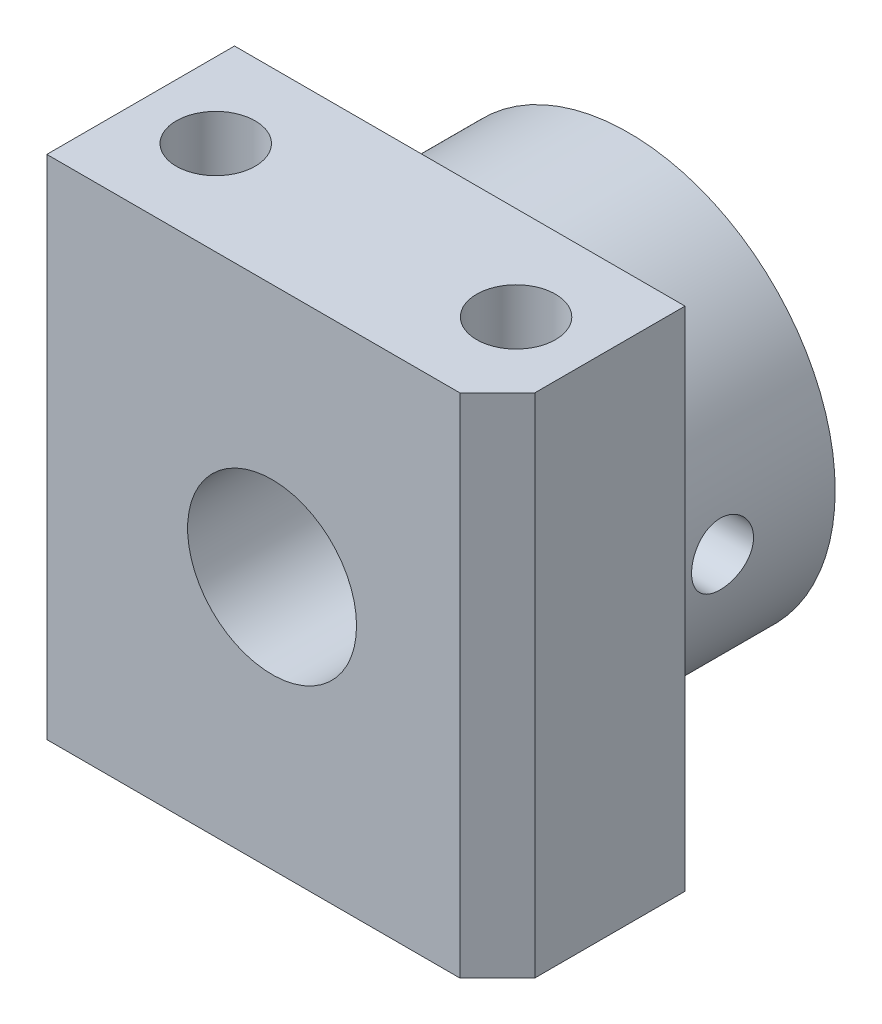
ISO-10303-21;
HEADER;
FILE_DESCRIPTION(('STEP AP214'),'2;1');
FILE_NAME('part.step','',(''),(''),'','','');
FILE_SCHEMA(('AUTOMOTIVE_DESIGN { 1 0 10303 214 1 1 1 1 }'));
ENDSEC;
DATA;
#1=APPLICATION_CONTEXT('core data for automotive mechanical design processes');
#2=APPLICATION_PROTOCOL_DEFINITION('international standard','automotive_design',2000,#1);
#3=PRODUCT_CONTEXT('',#1,'mechanical');
#4=PRODUCT('Part','Part','',(#3));
#5=PRODUCT_RELATED_PRODUCT_CATEGORY('part','',(#4));
#6=PRODUCT_DEFINITION_FORMATION('','',#4);
#7=PRODUCT_DEFINITION_CONTEXT('part definition',#1,'design');
#8=PRODUCT_DEFINITION('design','',#6,#7);
#9=PRODUCT_DEFINITION_SHAPE('','',#8);
#10=(LENGTH_UNIT() NAMED_UNIT(*) SI_UNIT(.MILLI.,.METRE.));
#11=(NAMED_UNIT(*) PLANE_ANGLE_UNIT() SI_UNIT($,.RADIAN.));
#12=(NAMED_UNIT(*) SI_UNIT($,.STERADIAN.) SOLID_ANGLE_UNIT());
#13=UNCERTAINTY_MEASURE_WITH_UNIT(LENGTH_MEASURE(1.E-05),#10,'distance_accuracy_value','');
#14=(GEOMETRIC_REPRESENTATION_CONTEXT(3) GLOBAL_UNCERTAINTY_ASSIGNED_CONTEXT((#13)) GLOBAL_UNIT_ASSIGNED_CONTEXT((#10,
#11,#12)) REPRESENTATION_CONTEXT('',''));
#15=CARTESIAN_POINT('',(0.,0.,0.));
#16=DIRECTION('',(0.,0.,1.));
#17=DIRECTION('',(1.,0.,0.));
#18=AXIS2_PLACEMENT_3D('',#15,#16,#17);
#19=CARTESIAN_POINT('',(12.,13.5,10.));
#20=DIRECTION('',(-1.,0.,0.));
#21=DIRECTION('',(0.,-1.,0.));
#22=AXIS2_PLACEMENT_3D('',#19,#20,#21);
#23=PLANE('',#22);
#24=DIRECTION('',(0.,0.,-1.));
#25=VECTOR('',#24,1.);
#26=CARTESIAN_POINT('',(12.,13.5,10.));
#27=LINE('',#26,#25);
#28=CARTESIAN_POINT('',(12.,13.5,7.99999999999999));
#29=VERTEX_POINT('',#28);
#30=CARTESIAN_POINT('',(12.,13.5,0.));
#31=VERTEX_POINT('',#30);
#32=EDGE_CURVE('E108',#29,#31,#27,.T.);
#33=ORIENTED_EDGE('',*,*,#32,.F.);
#34=DIRECTION('',(0.,-1.,0.));
#35=VECTOR('',#34,1.);
#36=CARTESIAN_POINT('',(12.,-13.5,7.99999999999999));
#37=LINE('',#36,#35);
#38=CARTESIAN_POINT('',(12.,-13.5,7.99999999999999));
#39=VERTEX_POINT('',#38);
#40=EDGE_CURVE('E59',#29,#39,#37,.T.);
#41=ORIENTED_EDGE('',*,*,#40,.T.);
#42=DIRECTION('',(0.,0.,-1.));
#43=VECTOR('',#42,1.);
#44=CARTESIAN_POINT('',(12.,-13.5,10.));
#45=LINE('',#44,#43);
#46=CARTESIAN_POINT('',(12.,-13.5,0.));
#47=VERTEX_POINT('',#46);
#48=EDGE_CURVE('E116',#39,#47,#45,.T.);
#49=ORIENTED_EDGE('',*,*,#48,.T.);
#50=DIRECTION('',(0.,1.,0.));
#51=VECTOR('',#50,1.);
#52=CARTESIAN_POINT('',(12.,13.5,0.));
#53=LINE('',#52,#51);
#54=EDGE_CURVE('E120',#47,#31,#53,.T.);
#55=ORIENTED_EDGE('',*,*,#54,.T.);
#56=EDGE_LOOP('',(#33,#41,#49,#55));
#57=FACE_BOUND('',#56,.T.);
#58=ADVANCED_FACE('F40',(#57),#23,.F.);
#59=CARTESIAN_POINT('',(-12.,13.5,10.));
#60=DIRECTION('',(0.,-1.,0.));
#61=DIRECTION('',(0.,0.,-1.));
#62=AXIS2_PLACEMENT_3D('',#59,#60,#61);
#63=PLANE('',#62);
#64=CARTESIAN_POINT('',(8.,13.5,5.));
#65=DIRECTION('',(0.,1.,0.));
#66=DIRECTION('',(0.,0.,1.));
#67=AXIS2_PLACEMENT_3D('',#64,#65,#66);
#68=CIRCLE('',#67,2.1);
#69=CARTESIAN_POINT('',(8.,13.5,7.1));
#70=VERTEX_POINT('',#69);
#71=EDGE_CURVE('E143',#70,#70,#68,.T.);
#72=ORIENTED_EDGE('',*,*,#71,.F.);
#73=EDGE_LOOP('',(#72));
#74=FACE_BOUND('',#73,.T.);
#75=CARTESIAN_POINT('',(-8.,13.5,5.));
#76=DIRECTION('',(0.,1.,0.));
#77=DIRECTION('',(0.,0.,1.));
#78=AXIS2_PLACEMENT_3D('',#75,#76,#77);
#79=CIRCLE('',#78,2.1);
#80=CARTESIAN_POINT('',(-8.,13.5,7.1));
#81=VERTEX_POINT('',#80);
#82=EDGE_CURVE('E139',#81,#81,#79,.T.);
#83=ORIENTED_EDGE('',*,*,#82,.F.);
#84=EDGE_LOOP('',(#83));
#85=FACE_BOUND('',#84,.T.);
#86=DIRECTION('',(-1.,0.,0.));
#87=VECTOR('',#86,1.);
#88=CARTESIAN_POINT('',(-12.,13.5,10.));
#89=LINE('',#88,#87);
#90=CARTESIAN_POINT('',(10.,13.5,10.));
#91=VERTEX_POINT('',#90);
#92=CARTESIAN_POINT('',(-12.,13.5,10.));
#93=VERTEX_POINT('',#92);
#94=EDGE_CURVE('E90',#91,#93,#89,.T.);
#95=ORIENTED_EDGE('',*,*,#94,.F.);
#96=DIRECTION('',(0.707106781186546,0.,-0.707106781186549));
#97=VECTOR('',#96,1.);
#98=CARTESIAN_POINT('',(10.,13.5,10.));
#99=LINE('',#98,#97);
#100=EDGE_CURVE('E67',#91,#29,#99,.T.);
#101=ORIENTED_EDGE('',*,*,#100,.T.);
#102=ORIENTED_EDGE('',*,*,#32,.T.);
#103=DIRECTION('',(-1.,0.,0.));
#104=VECTOR('',#103,1.);
#105=CARTESIAN_POINT('',(-12.,13.5,0.));
#106=LINE('',#105,#104);
#107=CARTESIAN_POINT('',(-12.,13.5,0.));
#108=VERTEX_POINT('',#107);
#109=EDGE_CURVE('E105',#31,#108,#106,.T.);
#110=ORIENTED_EDGE('',*,*,#109,.T.);
#111=DIRECTION('',(0.,0.,-1.));
#112=VECTOR('',#111,1.);
#113=CARTESIAN_POINT('',(-12.,13.5,10.));
#114=LINE('',#113,#112);
#115=EDGE_CURVE('E102',#93,#108,#114,.T.);
#116=ORIENTED_EDGE('',*,*,#115,.F.);
#117=EDGE_LOOP('',(#95,#101,#102,#110,#116));
#118=FACE_BOUND('',#117,.T.);
#119=ADVANCED_FACE('F103',(#74,#85,#118),#63,.F.);
#120=CARTESIAN_POINT('',(-12.,13.5,10.));
#121=DIRECTION('',(1.,0.,0.));
#122=DIRECTION('',(0.,1.,0.));
#123=AXIS2_PLACEMENT_3D('',#120,#121,#122);
#124=PLANE('',#123);
#125=DIRECTION('',(0.,-1.,0.));
#126=VECTOR('',#125,1.);
#127=CARTESIAN_POINT('',(-12.,13.5,0.));
#128=LINE('',#127,#126);
#129=CARTESIAN_POINT('',(-12.,-13.5,0.));
#130=VERTEX_POINT('',#129);
#131=EDGE_CURVE('E125',#108,#130,#128,.T.);
#132=ORIENTED_EDGE('',*,*,#131,.T.);
#133=DIRECTION('',(0.,0.,-1.));
#134=VECTOR('',#133,1.);
#135=CARTESIAN_POINT('',(-12.,-13.5,10.));
#136=LINE('',#135,#134);
#137=CARTESIAN_POINT('',(-12.,-13.5,10.));
#138=VERTEX_POINT('',#137);
#139=EDGE_CURVE('E109',#138,#130,#136,.T.);
#140=ORIENTED_EDGE('',*,*,#139,.F.);
#141=DIRECTION('',(0.,-1.,0.));
#142=VECTOR('',#141,1.);
#143=CARTESIAN_POINT('',(-12.,13.5,10.));
#144=LINE('',#143,#142);
#145=EDGE_CURVE('E95',#93,#138,#144,.T.);
#146=ORIENTED_EDGE('',*,*,#145,.F.);
#147=ORIENTED_EDGE('',*,*,#115,.T.);
#148=EDGE_LOOP('',(#132,#140,#146,#147));
#149=FACE_BOUND('',#148,.T.);
#150=ADVANCED_FACE('F111',(#149),#124,.F.);
#151=CARTESIAN_POINT('',(-12.,-13.5,10.));
#152=DIRECTION('',(0.,1.,0.));
#153=DIRECTION('',(0.,0.,1.));
#154=AXIS2_PLACEMENT_3D('',#151,#152,#153);
#155=PLANE('',#154);
#156=CARTESIAN_POINT('',(8.,-13.5,5.));
#157=DIRECTION('',(0.,1.,0.));
#158=DIRECTION('',(0.,0.,1.));
#159=AXIS2_PLACEMENT_3D('',#156,#157,#158);
#160=CIRCLE('',#159,2.1);
#161=CARTESIAN_POINT('',(8.,-13.5,7.1));
#162=VERTEX_POINT('',#161);
#163=EDGE_CURVE('E140',#162,#162,#160,.T.);
#164=ORIENTED_EDGE('',*,*,#163,.T.);
#165=EDGE_LOOP('',(#164));
#166=FACE_BOUND('',#165,.T.);
#167=CARTESIAN_POINT('',(-8.,-13.5,5.));
#168=DIRECTION('',(0.,1.,0.));
#169=DIRECTION('',(0.,0.,1.));
#170=AXIS2_PLACEMENT_3D('',#167,#168,#169);
#171=CIRCLE('',#170,2.1);
#172=CARTESIAN_POINT('',(-8.,-13.5,7.1));
#173=VERTEX_POINT('',#172);
#174=EDGE_CURVE('E136',#173,#173,#171,.T.);
#175=ORIENTED_EDGE('',*,*,#174,.T.);
#176=EDGE_LOOP('',(#175));
#177=FACE_BOUND('',#176,.T.);
#178=ORIENTED_EDGE('',*,*,#48,.F.);
#179=DIRECTION('',(-0.707106781186546,0.,0.707106781186549));
#180=VECTOR('',#179,1.);
#181=CARTESIAN_POINT('',(10.,-13.5,10.));
#182=LINE('',#181,#180);
#183=CARTESIAN_POINT('',(10.,-13.5,10.));
#184=VERTEX_POINT('',#183);
#185=EDGE_CURVE('E52',#39,#184,#182,.T.);
#186=ORIENTED_EDGE('',*,*,#185,.T.);
#187=DIRECTION('',(1.,0.,0.));
#188=VECTOR('',#187,1.);
#189=CARTESIAN_POINT('',(-12.,-13.5,10.));
#190=LINE('',#189,#188);
#191=EDGE_CURVE('E114',#138,#184,#190,.T.);
#192=ORIENTED_EDGE('',*,*,#191,.F.);
#193=ORIENTED_EDGE('',*,*,#139,.T.);
#194=DIRECTION('',(1.,0.,0.));
#195=VECTOR('',#194,1.);
#196=CARTESIAN_POINT('',(-12.,-13.5,0.));
#197=LINE('',#196,#195);
#198=EDGE_CURVE('E99',#130,#47,#197,.T.);
#199=ORIENTED_EDGE('',*,*,#198,.T.);
#200=EDGE_LOOP('',(#178,#186,#192,#193,#199));
#201=FACE_BOUND('',#200,.T.);
#202=ADVANCED_FACE('F148',(#166,#177,#201),#155,.F.);
#203=CARTESIAN_POINT('',(0.,0.,10.));
#204=DIRECTION('',(0.,0.,1.));
#205=DIRECTION('',(1.,0.,0.));
#206=AXIS2_PLACEMENT_3D('',#203,#204,#205);
#207=PLANE('',#206);
#208=CARTESIAN_POINT('',(0.,0.,10.));
#209=DIRECTION('',(0.,0.,1.));
#210=DIRECTION('',(1.,0.,0.));
#211=AXIS2_PLACEMENT_3D('',#208,#209,#210);
#212=CIRCLE('',#211,4.5);
#213=CARTESIAN_POINT('',(4.5,0.,10.));
#214=VERTEX_POINT('',#213);
#215=EDGE_CURVE('E132',#214,#214,#212,.T.);
#216=ORIENTED_EDGE('',*,*,#215,.F.);
#217=EDGE_LOOP('',(#216));
#218=FACE_BOUND('',#217,.T.);
#219=ORIENTED_EDGE('',*,*,#191,.T.);
#220=DIRECTION('',(0.,1.,0.));
#221=VECTOR('',#220,1.);
#222=CARTESIAN_POINT('',(10.,13.5,10.));
#223=LINE('',#222,#221);
#224=EDGE_CURVE('E98',#184,#91,#223,.T.);
#225=ORIENTED_EDGE('',*,*,#224,.T.);
#226=ORIENTED_EDGE('',*,*,#94,.T.);
#227=ORIENTED_EDGE('',*,*,#145,.T.);
#228=EDGE_LOOP('',(#219,#225,#226,#227));
#229=FACE_BOUND('',#228,.T.);
#230=ADVANCED_FACE('F93',(#218,#229),#207,.T.);
#231=CARTESIAN_POINT('',(0.,0.,0.));
#232=DIRECTION('',(0.,0.,1.));
#233=DIRECTION('',(1.,0.,0.));
#234=AXIS2_PLACEMENT_3D('',#231,#232,#233);
#235=PLANE('',#234);
#236=CARTESIAN_POINT('',(0.,0.,0.));
#237=DIRECTION('',(0.,0.,1.));
#238=DIRECTION('',(1.,0.,0.));
#239=AXIS2_PLACEMENT_3D('',#236,#237,#238);
#240=CIRCLE('',#239,11.);
#241=CARTESIAN_POINT('',(11.,0.,0.));
#242=VERTEX_POINT('',#241);
#243=EDGE_CURVE('E207',#242,#242,#240,.T.);
#244=ORIENTED_EDGE('',*,*,#243,.T.);
#245=EDGE_LOOP('',(#244));
#246=FACE_BOUND('',#245,.T.);
#247=ORIENTED_EDGE('',*,*,#54,.F.);
#248=ORIENTED_EDGE('',*,*,#198,.F.);
#249=ORIENTED_EDGE('',*,*,#131,.F.);
#250=ORIENTED_EDGE('',*,*,#109,.F.);
#251=EDGE_LOOP('',(#247,#248,#249,#250));
#252=FACE_BOUND('',#251,.T.);
#253=ADVANCED_FACE('F173',(#246,#252),#235,.F.);
#254=CARTESIAN_POINT('',(0.,0.,-9.));
#255=DIRECTION('',(0.,0.,1.));
#256=DIRECTION('',(1.,0.,0.));
#257=AXIS2_PLACEMENT_3D('',#254,#255,#256);
#258=CYLINDRICAL_SURFACE('',#257,11.);
#259=CARTESIAN_POINT('',(11.,0.,-4.64999999999999));
#260=CARTESIAN_POINT('',(10.9999985234843,0.0921266989298056,-4.64999620080322));
#261=CARTESIAN_POINT('',(10.9988305079074,0.184306853590343,-4.64225819907529));
#262=CARTESIAN_POINT('',(10.9942834757051,0.366090590794402,-4.61151848001896));
#263=CARTESIAN_POINT('',(10.9909023063232,0.455691575871649,-4.58850190076061));
#264=CARTESIAN_POINT('',(10.9823089334148,0.629659894844042,-4.5279082445356));
#265=CARTESIAN_POINT('',(10.9770981140801,0.714031128609474,-4.49034217254345));
#266=CARTESIAN_POINT('',(10.965421235029,0.875259471498773,-4.40174278264144));
#267=CARTESIAN_POINT('',(10.9589553496805,0.952117622197701,-4.35071133514089));
#268=CARTESIAN_POINT('',(10.945430880906,1.09675139151833,-4.23620500856613));
#269=CARTESIAN_POINT('',(10.9383684727936,1.16445981544804,-4.17264569817097));
#270=CARTESIAN_POINT('',(10.9244768724656,1.28829239735842,-4.03506954221674));
#271=CARTESIAN_POINT('',(10.9176476936836,1.34441588900228,-3.96105209554362));
#272=CARTESIAN_POINT('',(10.904958652046,1.44374702449936,-3.80420929212525));
#273=CARTESIAN_POINT('',(10.8991037317253,1.48688965740924,-3.72134232832053));
#274=CARTESIAN_POINT('',(10.8890783243689,1.55861895388161,-3.54943589729003));
#275=CARTESIAN_POINT('',(10.8849077455299,1.58720641078078,-3.46039676678172));
#276=CARTESIAN_POINT('',(10.8787608184054,1.62880518678801,-3.27938015394111));
#277=CARTESIAN_POINT('',(10.8767682731538,1.64193154004568,-3.18742966725117));
#278=CARTESIAN_POINT('',(10.8751538386764,1.65259186437324,-3.00261121741399));
#279=CARTESIAN_POINT('',(10.8755318133346,1.65012673071175,-2.90974330725126));
#280=CARTESIAN_POINT('',(10.8786009018765,1.62976806575865,-2.72653881178645));
#281=CARTESIAN_POINT('',(10.881272806377,1.61200265520524,-2.63618762086672));
#282=CARTESIAN_POINT('',(10.88859868939,1.56174829144106,-2.45976319424132));
#283=CARTESIAN_POINT('',(10.8932527239732,1.52925892171592,-2.37369007963118));
#284=CARTESIAN_POINT('',(10.9040396910003,1.45034563882709,-2.20787529158886));
#285=CARTESIAN_POINT('',(10.9101783644318,1.40386745711516,-2.12815983399838));
#286=CARTESIAN_POINT('',(10.92323878332,1.29833454441849,-1.97761094463988));
#287=CARTESIAN_POINT('',(10.9301605801575,1.23927898800725,-1.9067780963037));
#288=CARTESIAN_POINT('',(10.9440922036183,1.10956442386072,-1.77526257318632));
#289=CARTESIAN_POINT('',(10.951102218241,1.03879526260619,-1.71468851068503));
#290=CARTESIAN_POINT('',(10.9643561241331,0.888037798883598,-1.60626047204202));
#291=CARTESIAN_POINT('',(10.9706000120476,0.808049456046981,-1.55840655160172));
#292=CARTESIAN_POINT('',(10.9816246714393,0.641030058035049,-1.47677160485051));
#293=CARTESIAN_POINT('',(10.9864045711797,0.553994845620453,-1.44299895897568));
#294=CARTESIAN_POINT('',(10.9939553961278,0.375400500735764,-1.3905796713461));
#295=CARTESIAN_POINT('',(10.9967264571501,0.283841674547858,-1.37193200700288));
#296=CARTESIAN_POINT('',(10.9999293924726,0.0997365244080102,-1.35043644720165));
#297=CARTESIAN_POINT('',(11.0003833729943,0.00720800505751727,-1.34743923148276));
#298=CARTESIAN_POINT('',(10.9989611711675,-0.17703034542851,-1.35693330584214));
#299=CARTESIAN_POINT('',(10.9970850609551,-0.268740201820063,-1.36942411643492));
#300=CARTESIAN_POINT('',(10.9912271547687,-0.448285626174546,-1.40941551019531));
#301=CARTESIAN_POINT('',(10.9872555672878,-0.536137759387818,-1.43684334563394));
#302=CARTESIAN_POINT('',(10.9776505922421,-0.705996454507295,-1.50585349720794));
#303=CARTESIAN_POINT('',(10.9720171266372,-0.788002741674604,-1.547436478067));
#304=CARTESIAN_POINT('',(10.9596595071555,-0.944498477221107,-1.64392684702025));
#305=CARTESIAN_POINT('',(10.9529277178942,-1.01892891088072,-1.69892895401406));
#306=CARTESIAN_POINT('',(10.9391464931338,-1.15755604049547,-1.82056439279163));
#307=CARTESIAN_POINT('',(10.9320970391915,-1.22175214127274,-1.88719840055712));
#308=CARTESIAN_POINT('',(10.9184049073494,-1.33863163452914,-2.03087088649415));
#309=CARTESIAN_POINT('',(10.9117660961935,-1.39121493222162,-2.10799121771425));
#310=CARTESIAN_POINT('',(10.8997154101539,-1.48268042197641,-2.27005764456295));
#311=CARTESIAN_POINT('',(10.8943035021219,-1.52156298422078,-2.35500352867362));
#312=CARTESIAN_POINT('',(10.8853473630951,-1.58436814056337,-2.53001128698545));
#313=CARTESIAN_POINT('',(10.8817965630708,-1.60834340855798,-2.62005390706837));
#314=CARTESIAN_POINT('',(10.8769472052758,-1.64082104451744,-2.80294491697862));
#315=CARTESIAN_POINT('',(10.8756484919695,-1.64932448101372,-2.89579311259414));
#316=CARTESIAN_POINT('',(10.8754561587193,-1.65059165336383,-3.08066196964736));
#317=CARTESIAN_POINT('',(10.8765384896685,-1.64351277384043,-3.17268156593261));
#318=CARTESIAN_POINT('',(10.8809340267229,-1.61415352498815,-3.35420578965587));
#319=CARTESIAN_POINT('',(10.8842472292523,-1.59187318002489,-3.44371042112473));
#320=CARTESIAN_POINT('',(10.8927227872353,-1.53279910870531,-3.61762039045775));
#321=CARTESIAN_POINT('',(10.8978837408768,-1.49601638256744,-3.70202953747678));
#322=CARTESIAN_POINT('',(10.9094750001347,-1.40899734406539,-3.86350399718263));
#323=CARTESIAN_POINT('',(10.91590534873,-1.35876057615651,-3.940569061084));
#324=CARTESIAN_POINT('',(10.9293881770143,-1.2456877142508,-4.08596736377268));
#325=CARTESIAN_POINT('',(10.9364460467016,-1.18273505943785,-4.15420946657177));
#326=CARTESIAN_POINT('',(10.950343677093,-1.04626372519111,-4.2792170102666));
#327=CARTESIAN_POINT('',(10.9571833867183,-0.972742593186028,-4.33597977983377));
#328=CARTESIAN_POINT('',(10.9699170436957,-0.816745278298088,-4.43669644426809));
#329=CARTESIAN_POINT('',(10.975805578417,-0.734222034441231,-4.48057812013621));
#330=CARTESIAN_POINT('',(10.9859203168326,-0.562927057273586,-4.55379236843384));
#331=CARTESIAN_POINT('',(10.9901482412233,-0.474161904806371,-4.58314000905905));
#332=CARTESIAN_POINT('',(10.9955003318766,-0.320832300678259,-4.61979547698111));
#333=CARTESIAN_POINT('',(10.9971790409751,-0.257214246844803,-4.63110486169268));
#334=CARTESIAN_POINT('',(10.9994293854269,-0.129072868760136,-4.6462084074839));
#335=CARTESIAN_POINT('',(11.0000010345365,-0.0645495557678581,-4.65000266194779));
#336=CARTESIAN_POINT('',(11.,0.,-4.64999999999999));
#337=B_SPLINE_CURVE_WITH_KNOTS('',3,(#259,#260,#261,#262,#263,#264,#265,#266,#267,#268,#269,
#270,#271,#272,#273,#274,#275,#276,#277,#278,#279,#280,#281,#282,#283,#284,#285,#286,#287,#288,
#289,#290,#291,#292,#293,#294,#295,#296,#297,#298,#299,#300,#301,#302,#303,#304,#305,#306,#307,
#308,#309,#310,#311,#312,#313,#314,#315,#316,#317,#318,#319,#320,#321,#322,#323,#324,#325,#326,
#327,#328,#329,#330,#331,#332,#333,#334,#335,#336),.UNSPECIFIED.,.T.,.F.,(4,2,2,2,2,2,2,2,2,2,2,
2,2,2,2,2,2,2,2,2,2,2,2,2,2,2,2,2,2,2,2,2,2,2,2,2,2,2,4),(0.,0.276144225534828,
0.552557459222062,0.828762025941555,1.10492824661735,1.38302357750527,1.66113489929837,
1.94061672634911,2.22008331848055,2.49745721066515,2.77481517608879,3.04987294915319,
3.32493850359395,3.60108521823772,3.87725006139385,4.15617720380947,4.43510556762532,
4.71419969883359,4.99327495912738,5.26968264398677,5.54608177190267,5.82114663862539,
6.09622442413897,6.37330306840594,6.65039782031488,6.92979503243134,7.20918469489711,
7.4875814580288,7.76595899350889,8.04153777087165,8.31711610652515,8.59248581382555,
8.86786484613561,9.14589312962286,9.423986038156,9.703609557232,9.98294256587579,
10.1764283717668,10.3699117733561),.UNSPECIFIED.);
#338=CARTESIAN_POINT('',(11.,0.,-4.64999999999999));
#339=VERTEX_POINT('',#338);
#340=EDGE_CURVE('E11',#339,#339,#337,.T.);
#341=ORIENTED_EDGE('',*,*,#340,.F.);
#342=EDGE_LOOP('',(#341));
#343=FACE_BOUND('',#342,.T.);
#344=CARTESIAN_POINT('',(0.,0.,-9.));
#345=DIRECTION('',(0.,0.,1.));
#346=DIRECTION('',(1.,0.,0.));
#347=AXIS2_PLACEMENT_3D('',#344,#345,#346);
#348=CIRCLE('',#347,11.);
#349=CARTESIAN_POINT('',(11.,0.,-9.));
#350=VERTEX_POINT('',#349);
#351=EDGE_CURVE('E123',#350,#350,#348,.T.);
#352=ORIENTED_EDGE('',*,*,#351,.T.);
#353=EDGE_LOOP('',(#352));
#354=FACE_BOUND('',#353,.T.);
#355=ORIENTED_EDGE('',*,*,#243,.F.);
#356=EDGE_LOOP('',(#355));
#357=FACE_BOUND('',#356,.T.);
#358=ADVANCED_FACE('F176',(#343,#354,#357),#258,.T.);
#359=CARTESIAN_POINT('',(0.,0.,-9.));
#360=DIRECTION('',(0.,0.,1.));
#361=DIRECTION('',(1.,0.,0.));
#362=AXIS2_PLACEMENT_3D('',#359,#360,#361);
#363=PLANE('',#362);
#364=CARTESIAN_POINT('',(0.,0.,-9.));
#365=DIRECTION('',(0.,0.,1.));
#366=DIRECTION('',(1.,0.,0.));
#367=AXIS2_PLACEMENT_3D('',#364,#365,#366);
#368=CIRCLE('',#367,4.5);
#369=CARTESIAN_POINT('',(4.5,0.,-9.));
#370=VERTEX_POINT('',#369);
#371=EDGE_CURVE('E135',#370,#370,#368,.T.);
#372=ORIENTED_EDGE('',*,*,#371,.T.);
#373=EDGE_LOOP('',(#372));
#374=FACE_BOUND('',#373,.T.);
#375=ORIENTED_EDGE('',*,*,#351,.F.);
#376=EDGE_LOOP('',(#375));
#377=FACE_BOUND('',#376,.T.);
#378=ADVANCED_FACE('F183',(#374,#377),#363,.F.);
#379=CARTESIAN_POINT('',(0.,0.,-9.));
#380=DIRECTION('',(0.,0.,1.));
#381=DIRECTION('',(1.,0.,0.));
#382=AXIS2_PLACEMENT_3D('',#379,#380,#381);
#383=CYLINDRICAL_SURFACE('',#382,4.5);
#384=CARTESIAN_POINT('',(4.5,0.,-4.64999999999999));
#385=CARTESIAN_POINT('',(4.50000187312166,0.0894980405487709,-4.65000254390648));
#386=CARTESIAN_POINT('',(4.49730650044318,0.178978291571087,-4.64269529142891));
#387=CARTESIAN_POINT('',(4.48682263014799,0.355272366383175,-4.61377154163435));
#388=CARTESIAN_POINT('',(4.47903461550756,0.442086442210484,-4.59215640124728));
#389=CARTESIAN_POINT('',(4.45920359929643,0.610480707825131,-4.53547887242643));
#390=CARTESIAN_POINT('',(4.44716858549937,0.692070385655244,-4.50044171766083));
#391=CARTESIAN_POINT('',(4.42004835277079,0.848210035208665,-4.4180401184277));
#392=CARTESIAN_POINT('',(4.40496235552077,0.922758203480268,-4.37067252752774));
#393=CARTESIAN_POINT('',(4.37261472251702,1.06574575334141,-4.26293004771411));
#394=CARTESIAN_POINT('',(4.35529340394672,1.13385883746544,-4.20214019580039));
#395=CARTESIAN_POINT('',(4.32072800510533,1.25918368508667,-4.07015984757391));
#396=CARTESIAN_POINT('',(4.30348394837178,1.3163923213977,-3.99896637801359));
#397=CARTESIAN_POINT('',(4.27033915319588,1.42031403523734,-3.84506422286707));
#398=CARTESIAN_POINT('',(4.25450933736635,1.46657391576721,-3.76203272594675));
#399=CARTESIAN_POINT('',(4.22690959285541,1.54432842922361,-3.58869562401996));
#400=CARTESIAN_POINT('',(4.2151381240418,1.57582866503039,-3.49839279454968));
#401=CARTESIAN_POINT('',(4.1976239419785,1.62189472661054,-3.31682467115964));
#402=CARTESIAN_POINT('',(4.19166116733056,1.63708114059972,-3.22573875357942));
#403=CARTESIAN_POINT('',(4.1857939562529,1.65202901980716,-3.04213128642243));
#404=CARTESIAN_POINT('',(4.18588715691154,1.65179650116137,-2.94961031086177));
#405=CARTESIAN_POINT('',(4.19193096938205,1.63638914780494,-2.77135264644563));
#406=CARTESIAN_POINT('',(4.19754849742045,1.62206399631966,-2.68552915714842));
#407=CARTESIAN_POINT('',(4.21345623329944,1.58027880828001,-2.51760161729815));
#408=CARTESIAN_POINT('',(4.22374711354922,1.55281688155561,-2.43549810385119));
#409=CARTESIAN_POINT('',(4.24805002566016,1.48505299309965,-2.27556852506449));
#410=CARTESIAN_POINT('',(4.26212698851788,1.44452426374461,-2.19784884359773));
#411=CARTESIAN_POINT('',(4.29239316402159,1.35193509708642,-2.0500623895942));
#412=CARTESIAN_POINT('',(4.30858308210572,1.29987080441402,-1.97999818735782));
#413=CARTESIAN_POINT('',(4.34251612515206,1.18176093170674,-1.84479270977528));
#414=CARTESIAN_POINT('',(4.36029232666252,1.11503359641234,-1.78025388013981));
#415=CARTESIAN_POINT('',(4.39450063291509,0.971494676395607,-1.66310774751436));
#416=CARTESIAN_POINT('',(4.41093254863956,0.89468167748787,-1.61050212059367));
#417=CARTESIAN_POINT('',(4.4409024255833,0.731669659501208,-1.51809004728483));
#418=CARTESIAN_POINT('',(4.4543959694152,0.645352826282144,-1.47847599877282));
#419=CARTESIAN_POINT('',(4.47664096916481,0.46666300916163,-1.41452854105571));
#420=CARTESIAN_POINT('',(4.48539443466537,0.374292610352293,-1.39018865558688));
#421=CARTESIAN_POINT('',(4.49682396726022,0.191194294142474,-1.35861953957959));
#422=CARTESIAN_POINT('',(4.49978809033336,0.10062418366951,-1.3505785008765));
#423=CARTESIAN_POINT('',(4.50018965331075,-0.0806087804662279,-1.34948219887635));
#424=CARTESIAN_POINT('',(4.49762825512724,-0.171271610624712,-1.35642378501784));
#425=CARTESIAN_POINT('',(4.48745682705728,-0.346662609239425,-1.38447287521377));
#426=CARTESIAN_POINT('',(4.48003394175082,-0.431486677218896,-1.4050555967998));
#427=CARTESIAN_POINT('',(4.46107341485632,-0.59642345500699,-1.45911903164119));
#428=CARTESIAN_POINT('',(4.44953523790571,-0.67653555024988,-1.49260142307343));
#429=CARTESIAN_POINT('',(4.42307607926934,-0.8323626419651,-1.57256765302289));
#430=CARTESIAN_POINT('',(4.40806706717036,-0.907883970291709,-1.61939887802943));
#431=CARTESIAN_POINT('',(4.3763358523135,-1.05024405275336,-1.7243378350693));
#432=CARTESIAN_POINT('',(4.35961303845657,-1.11707969038523,-1.78244959611149));
#433=CARTESIAN_POINT('',(4.32515065933686,-1.24404133628279,-1.91209357545901));
#434=CARTESIAN_POINT('',(4.30740610338455,-1.30359029343044,-1.98419103585753));
#435=CARTESIAN_POINT('',(4.27380852297081,-1.40984950467223,-2.1377129969529));
#436=CARTESIAN_POINT('',(4.25795562992762,-1.45655886706313,-2.21913814489676));
#437=CARTESIAN_POINT('',(4.23002560504665,-1.53579382265496,-2.38952242292055));
#438=CARTESIAN_POINT('',(4.21795848950301,-1.56828187774045,-2.47850076068636));
#439=CARTESIAN_POINT('',(4.19928974047472,-1.61761394898778,-2.66122730886059));
#440=CARTESIAN_POINT('',(4.19268492684157,-1.63446706849553,-2.7549727100912));
#441=CARTESIAN_POINT('',(4.1860988372618,-1.65125710177471,-2.93835081602328));
#442=CARTESIAN_POINT('',(4.18573448481152,-1.65217243300454,-3.02788097517927));
#443=CARTESIAN_POINT('',(4.19069566161615,-1.63954717871468,-3.20574693013029));
#444=CARTESIAN_POINT('',(4.19602069888094,-1.62600784316279,-3.29408282853019));
#445=CARTESIAN_POINT('',(4.2114483791884,-1.58560618262559,-3.46456145157958));
#446=CARTESIAN_POINT('',(4.22141367092351,-1.55912586141552,-3.54680818204512));
#447=CARTESIAN_POINT('',(4.24492471671342,-1.4939241392604,-3.70574349177708));
#448=CARTESIAN_POINT('',(4.25847135611488,-1.45519971097929,-3.78243069068762));
#449=CARTESIAN_POINT('',(4.2884739077351,-1.36432712245295,-3.932295889875));
#450=CARTESIAN_POINT('',(4.30504252485518,-1.31159775727104,-4.00509865699178));
#451=CARTESIAN_POINT('',(4.33881789562838,-1.19512859971418,-4.14113594668975));
#452=CARTESIAN_POINT('',(4.35602484618159,-1.1313853874593,-4.20436748585981));
#453=CARTESIAN_POINT('',(4.39018825131619,-0.990822959680453,-4.32273598782214));
#454=CARTESIAN_POINT('',(4.40708755839953,-0.913503924168084,-4.37729844221117));
#455=CARTESIAN_POINT('',(4.43780201964488,-0.75020529087003,-4.47262640729801));
#456=CARTESIAN_POINT('',(4.45161716121914,-0.664225657739007,-4.51339186168503));
#457=CARTESIAN_POINT('',(4.47487028882041,-0.483740409554465,-4.58050198597572));
#458=CARTESIAN_POINT('',(4.4841912822027,-0.389076279627031,-4.60646413537769));
#459=CARTESIAN_POINT('',(4.49675375402847,-0.196266589308526,-4.64120791312534));
#460=CARTESIAN_POINT('',(4.49999794637322,-0.0981226029863977,-4.64999721094757));
#461=CARTESIAN_POINT('',(4.5,0.,-4.64999999999999));
#462=B_SPLINE_CURVE_WITH_KNOTS('',3,(#384,#385,#386,#387,#388,#389,#390,#391,#392,#393,#394,
#395,#396,#397,#398,#399,#400,#401,#402,#403,#404,#405,#406,#407,#408,#409,#410,#411,#412,#413,
#414,#415,#416,#417,#418,#419,#420,#421,#422,#423,#424,#425,#426,#427,#428,#429,#430,#431,#432,
#433,#434,#435,#436,#437,#438,#439,#440,#441,#442,#443,#444,#445,#446,#447,#448,#449,#450,#451,
#452,#453,#454,#455,#456,#457,#458,#459,#460,#461),.UNSPECIFIED.,.T.,.F.,(4,2,2,2,2,2,2,2,2,2,2,
2,2,2,2,2,2,2,2,2,2,2,2,2,2,2,2,2,2,2,2,2,2,2,2,2,2,2,4),(0.,0.268132361609607,
0.536239297754019,0.803844641489628,1.07151833876249,1.34905484379516,1.62667082160897,
1.91430403735889,2.2018279765813,2.4779782527225,2.75402078159867,3.0143802311677,
3.27477715353452,3.53996116377783,3.8052339367982,4.08749171731046,4.36978911762055,
4.65609597277785,4.94228135131293,5.21382288338164,5.48530732098666,5.74691072925961,
6.00854818221123,6.27773772586494,6.54702359200246,6.83123187041934,7.11545988197054,
7.40043367420939,7.68524143786794,7.95249872207515,8.2197328970716,8.47951592305797,
8.73936323027912,9.01238924191313,9.28550018296945,9.57248753147224,9.85947605126555,
10.1535786164874,10.4475498040654),.UNSPECIFIED.);
#463=CARTESIAN_POINT('',(4.5,0.,-4.64999999999999));
#464=VERTEX_POINT('',#463);
#465=EDGE_CURVE('E194',#464,#464,#462,.T.);
#466=ORIENTED_EDGE('',*,*,#465,.T.);
#467=EDGE_LOOP('',(#466));
#468=FACE_BOUND('',#467,.T.);
#469=ORIENTED_EDGE('',*,*,#371,.F.);
#470=EDGE_LOOP('',(#469));
#471=FACE_BOUND('',#470,.T.);
#472=ORIENTED_EDGE('',*,*,#215,.T.);
#473=EDGE_LOOP('',(#472));
#474=FACE_BOUND('',#473,.T.);
#475=ADVANCED_FACE('F187',(#468,#471,#474),#383,.F.);
#476=CARTESIAN_POINT('',(-8.,-23.513519789092,5.));
#477=DIRECTION('',(0.,1.,0.));
#478=DIRECTION('',(0.,0.,1.));
#479=AXIS2_PLACEMENT_3D('',#476,#477,#478);
#480=CYLINDRICAL_SURFACE('',#479,2.1);
#481=ORIENTED_EDGE('',*,*,#82,.T.);
#482=EDGE_LOOP('',(#481));
#483=FACE_BOUND('',#482,.T.);
#484=ORIENTED_EDGE('',*,*,#174,.F.);
#485=EDGE_LOOP('',(#484));
#486=FACE_BOUND('',#485,.T.);
#487=ADVANCED_FACE('F158',(#483,#486),#480,.F.);
#488=CARTESIAN_POINT('',(8.,-23.513519789092,5.));
#489=DIRECTION('',(0.,1.,0.));
#490=DIRECTION('',(0.,0.,1.));
#491=AXIS2_PLACEMENT_3D('',#488,#489,#490);
#492=CYLINDRICAL_SURFACE('',#491,2.1);
#493=ORIENTED_EDGE('',*,*,#71,.T.);
#494=EDGE_LOOP('',(#493));
#495=FACE_BOUND('',#494,.T.);
#496=ORIENTED_EDGE('',*,*,#163,.F.);
#497=EDGE_LOOP('',(#496));
#498=FACE_BOUND('',#497,.T.);
#499=ADVANCED_FACE('F152',(#495,#498),#492,.F.);
#500=CARTESIAN_POINT('',(10.,0.,10.));
#501=DIRECTION('',(0.707106781186549,0.,0.707106781186546));
#502=DIRECTION('',(0.,-1.,0.));
#503=AXIS2_PLACEMENT_3D('',#500,#501,#502);
#504=PLANE('',#503);
#505=ORIENTED_EDGE('',*,*,#185,.F.);
#506=ORIENTED_EDGE('',*,*,#40,.F.);
#507=ORIENTED_EDGE('',*,*,#100,.F.);
#508=ORIENTED_EDGE('',*,*,#224,.F.);
#509=EDGE_LOOP('',(#505,#506,#507,#508));
#510=FACE_BOUND('',#509,.T.);
#511=ADVANCED_FACE('F42',(#510),#504,.T.);
#512=CARTESIAN_POINT('',(11.,0.,-3.));
#513=DIRECTION('',(1.,0.,0.));
#514=DIRECTION('',(0.,0.,-1.));
#515=AXIS2_PLACEMENT_3D('',#512,#513,#514);
#516=CYLINDRICAL_SURFACE('',#515,1.64999999999999);
#517=ORIENTED_EDGE('',*,*,#340,.T.);
#518=EDGE_LOOP('',(#517));
#519=FACE_BOUND('',#518,.T.);
#520=ORIENTED_EDGE('',*,*,#465,.F.);
#521=EDGE_LOOP('',(#520));
#522=FACE_BOUND('',#521,.T.);
#523=ADVANCED_FACE('F151',(#519,#522),#516,.F.);
#524=CLOSED_SHELL('',(#58,#119,#150,#202,#230,#253,#358,#378,#475,#487,#499,#511,#523));
#525=MANIFOLD_SOLID_BREP('B2',#524);
#526=ADVANCED_BREP_SHAPE_REPRESENTATION('',(#18,#525),#14);
#527=SHAPE_DEFINITION_REPRESENTATION(#9,#526);
ENDSEC;
END-ISO-10303-21;
